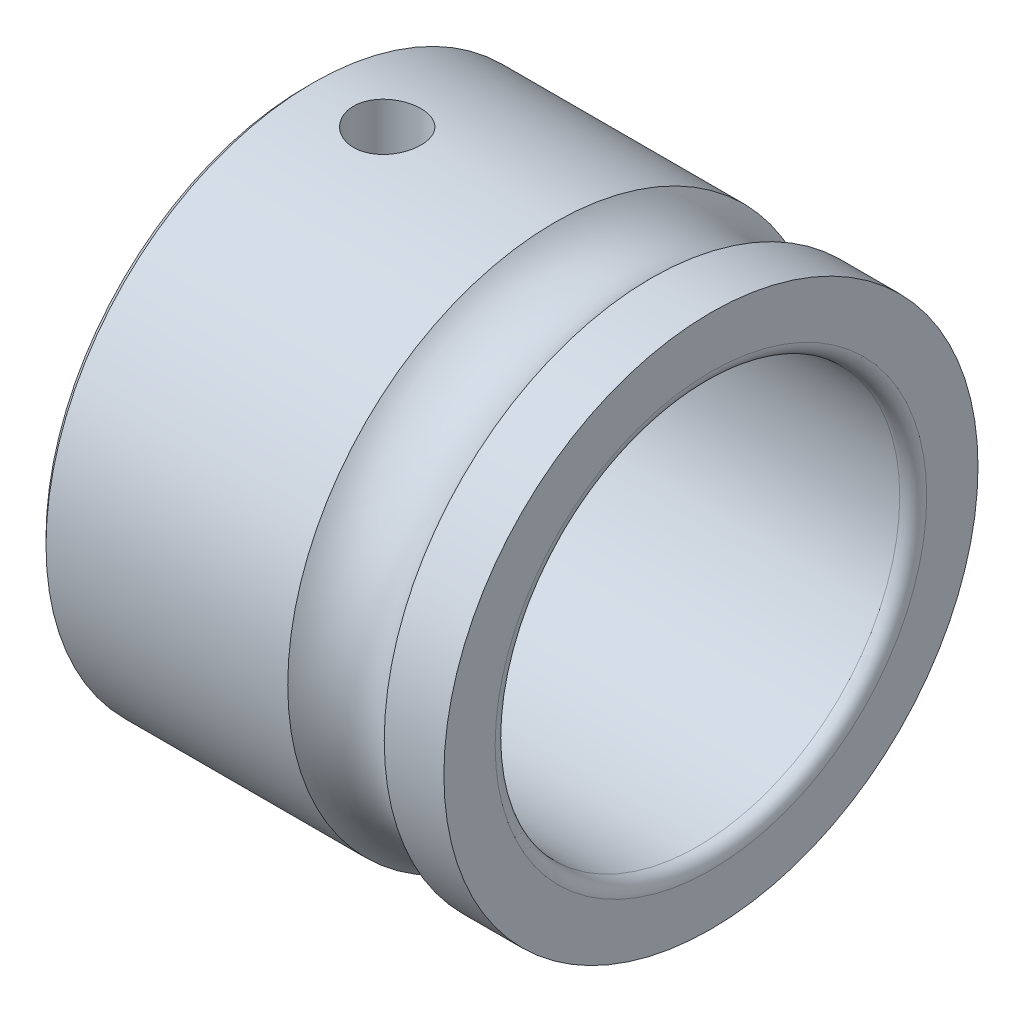
ISO-10303-21;
HEADER;
FILE_DESCRIPTION(('STEP AP214'),'2;1');
FILE_NAME('part.step','',(''),(''),'','','');
FILE_SCHEMA(('AUTOMOTIVE_DESIGN { 1 0 10303 214 1 1 1 1 }'));
ENDSEC;
DATA;
#1=APPLICATION_CONTEXT('core data for automotive mechanical design processes');
#2=APPLICATION_PROTOCOL_DEFINITION('international standard','automotive_design',2000,#1);
#3=PRODUCT_CONTEXT('',#1,'mechanical');
#4=PRODUCT('Part','Part','',(#3));
#5=PRODUCT_RELATED_PRODUCT_CATEGORY('part','',(#4));
#6=PRODUCT_DEFINITION_FORMATION('','',#4);
#7=PRODUCT_DEFINITION_CONTEXT('part definition',#1,'design');
#8=PRODUCT_DEFINITION('design','',#6,#7);
#9=PRODUCT_DEFINITION_SHAPE('','',#8);
#10=(LENGTH_UNIT() NAMED_UNIT(*) SI_UNIT(.MILLI.,.METRE.));
#11=(NAMED_UNIT(*) PLANE_ANGLE_UNIT() SI_UNIT($,.RADIAN.));
#12=(NAMED_UNIT(*) SI_UNIT($,.STERADIAN.) SOLID_ANGLE_UNIT());
#13=UNCERTAINTY_MEASURE_WITH_UNIT(LENGTH_MEASURE(1.E-05),#10,'distance_accuracy_value','');
#14=(GEOMETRIC_REPRESENTATION_CONTEXT(3) GLOBAL_UNCERTAINTY_ASSIGNED_CONTEXT((#13)) GLOBAL_UNIT_ASSIGNED_CONTEXT((#10,
#11,#12)) REPRESENTATION_CONTEXT('',''));
#15=CARTESIAN_POINT('',(0.,0.,0.));
#16=DIRECTION('',(0.,0.,1.));
#17=DIRECTION('',(1.,0.,0.));
#18=AXIS2_PLACEMENT_3D('',#15,#16,#17);
#19=CARTESIAN_POINT('',(0.,0.,0.));
#20=DIRECTION('',(-1.,0.,0.));
#21=DIRECTION('',(0.,0.,1.));
#22=AXIS2_PLACEMENT_3D('',#19,#20,#21);
#23=CYLINDRICAL_SURFACE('',#22,15.);
#24=CARTESIAN_POINT('',(-8.00000000000001,-2.50000000000005,-14.790199457749));
#25=CARTESIAN_POINT('',(-8.13937574816183,-2.49999439841987,-14.790201973666));
#26=CARTESIAN_POINT('',(-8.27882760607148,-2.48830516902833,-14.7921909238523));
#27=CARTESIAN_POINT('',(-8.55381854326318,-2.44187742806642,-14.7999245720004));
#28=CARTESIAN_POINT('',(-8.68935389375808,-2.40711766030865,-14.8056727334637));
#29=CARTESIAN_POINT('',(-8.95249228334162,-2.31562954367054,-14.8202560936731));
#30=CARTESIAN_POINT('',(-9.08010184866226,-2.25891955493203,-14.8290887118401));
#31=CARTESIAN_POINT('',(-9.32398095471778,-2.12518649688951,-14.8488427210228));
#32=CARTESIAN_POINT('',(-9.44025176957734,-2.04816571350137,-14.8597638769423));
#33=CARTESIAN_POINT('',(-9.65931284974457,-1.87518752696659,-14.8825847115588));
#34=CARTESIAN_POINT('',(-9.76197513138622,-1.77906904893238,-14.8944921732794));
#35=CARTESIAN_POINT('',(-9.94979330686182,-1.57097200469532,-14.9178748066858));
#36=CARTESIAN_POINT('',(-10.0349481631154,-1.45899249915002,-14.9293499527173));
#37=CARTESIAN_POINT('',(-10.1858145672193,-1.22152286994841,-14.9506573698271));
#38=CARTESIAN_POINT('',(-10.2514070077318,-1.09595608145676,-14.9604794243234));
#39=CARTESIAN_POINT('',(-10.3605210705306,-0.835395621723921,-14.9772873695709));
#40=CARTESIAN_POINT('',(-10.4040441278849,-0.700402564078241,-14.9842734447266));
#41=CARTESIAN_POINT('',(-10.4673925349839,-0.426143726344296,-14.994567347244));
#42=CARTESIAN_POINT('',(-10.4874329160047,-0.286928886679325,-14.9979085311091));
#43=CARTESIAN_POINT('',(-10.5039157541526,-0.00707528552585247,-15.0006507934278));
#44=CARTESIAN_POINT('',(-10.5003598152472,0.133563378528843,-15.0000521396931));
#45=CARTESIAN_POINT('',(-10.4699186484718,0.410802185078819,-14.9950085843139));
#46=CARTESIAN_POINT('',(-10.4432648365909,0.547428530700084,-14.990601836924));
#47=CARTESIAN_POINT('',(-10.3677489257535,0.814241979611734,-14.9784797877164));
#48=CARTESIAN_POINT('',(-10.3188861504105,0.944428886651446,-14.9707643851321));
#49=CARTESIAN_POINT('',(-10.2001093596847,1.19535614778259,-14.9528269851196));
#50=CARTESIAN_POINT('',(-10.1300999879176,1.31605052301899,-14.9425936732688));
#51=CARTESIAN_POINT('',(-9.97108717736496,1.54406552984658,-14.920757380715));
#52=CARTESIAN_POINT('',(-9.8820822012892,1.65138507791582,-14.9091542891914));
#53=CARTESIAN_POINT('',(-9.68632119338071,1.85097127344661,-14.885702682326));
#54=CARTESIAN_POINT('',(-9.57936290509903,1.94303950225315,-14.8738528973104));
#55=CARTESIAN_POINT('',(-9.35141290978419,2.107954588448,-14.8513795978481));
#56=CARTESIAN_POINT('',(-9.23042107331719,2.18080126853236,-14.8407560947133));
#57=CARTESIAN_POINT('',(-8.97760835812253,2.30524443448823,-14.8219375456182));
#58=CARTESIAN_POINT('',(-8.84577550190792,2.35681702727918,-14.813745233026));
#59=CARTESIAN_POINT('',(-8.57515092769247,2.43702987081556,-14.8007618868988));
#60=CARTESIAN_POINT('',(-8.43635982356759,2.4656721407679,-14.7959705538832));
#61=CARTESIAN_POINT('',(-8.15753384383788,2.49893188487921,-14.7903895942212));
#62=CARTESIAN_POINT('',(-8.01753362029791,2.50383220791238,-14.7895528575867));
#63=CARTESIAN_POINT('',(-7.73871332830919,2.4902227026824,-14.7918503478236));
#64=CARTESIAN_POINT('',(-7.59989321448604,2.47171377862461,-14.7949844213185));
#65=CARTESIAN_POINT('',(-7.32827224080916,2.41205233492804,-14.8048268745502));
#66=CARTESIAN_POINT('',(-7.19543886012201,2.37104379064633,-14.8115125191835));
#67=CARTESIAN_POINT('',(-6.93852983372053,2.26769819019222,-14.827685730055));
#68=CARTESIAN_POINT('',(-6.81445471244911,2.20535985810088,-14.8371734639058));
#69=CARTESIAN_POINT('',(-6.57732540559391,2.06045667322917,-14.8579912839739));
#70=CARTESIAN_POINT('',(-6.46438342724396,1.97771056415931,-14.8693375560035));
#71=CARTESIAN_POINT('',(-6.25388646730502,1.79458946570792,-14.8925466667987));
#72=CARTESIAN_POINT('',(-6.15633256889028,1.69421323638399,-14.9044095418533));
#73=CARTESIAN_POINT('',(-5.97834810727131,1.47742807032875,-14.9274642211826));
#74=CARTESIAN_POINT('',(-5.89810617371548,1.36086325338614,-14.9386477634467));
#75=CARTESIAN_POINT('',(-5.75834467299514,1.11574344794927,-14.9589511243294));
#76=CARTESIAN_POINT('',(-5.69882443552617,0.987188847470571,-14.9680710096998));
#77=CARTESIAN_POINT('',(-5.60248941604516,0.722299051501274,-14.9831835816958));
#78=CARTESIAN_POINT('',(-5.5655759242651,0.586000562602557,-14.9891898456762));
#79=CARTESIAN_POINT('',(-5.51518440103619,0.309030734874157,-14.9974558316928));
#80=CARTESIAN_POINT('',(-5.50170444126766,0.168359756821567,-14.9997158620019));
#81=CARTESIAN_POINT('',(-5.49861811768782,-0.111541275773728,-15.0002303788781));
#82=CARTESIAN_POINT('',(-5.50872474605894,-0.250768160602714,-14.9985330202419));
#83=CARTESIAN_POINT('',(-5.55190392226945,-0.525511974314754,-14.9914217838733));
#84=CARTESIAN_POINT('',(-5.58497634150969,-0.661028923967529,-14.9860079269518));
#85=CARTESIAN_POINT('',(-5.67303816554367,-0.924396445918585,-14.972069888274));
#86=CARTESIAN_POINT('',(-5.72800316821007,-1.05225537215387,-14.9635491704088));
#87=CARTESIAN_POINT('',(-5.8582579362306,-1.29698045298221,-14.9443275687803));
#88=CARTESIAN_POINT('',(-5.93354866506247,-1.41384608611827,-14.9336265816742));
#89=CARTESIAN_POINT('',(-6.10333509246052,-1.63471294552644,-14.9110762961641));
#90=CARTESIAN_POINT('',(-6.19804095475128,-1.73855143060279,-14.8992152454112));
#91=CARTESIAN_POINT('',(-6.40352830790383,-1.92896387595095,-14.8757630331437));
#92=CARTESIAN_POINT('',(-6.51431355891255,-2.01553378671194,-14.8641719354951));
#93=CARTESIAN_POINT('',(-6.74974532248963,-2.16951427091091,-14.8424834353391));
#94=CARTESIAN_POINT('',(-6.8744843397655,-2.23678498905774,-14.8323971784578));
#95=CARTESIAN_POINT('',(-7.13360923583816,-2.34931453640431,-14.8149921009131));
#96=CARTESIAN_POINT('',(-7.26798532267737,-2.39459535522311,-14.8076705172488));
#97=CARTESIAN_POINT('',(-7.50240376948739,-2.45202605312746,-14.7982474485649));
#98=CARTESIAN_POINT('',(-7.60102680796262,-2.46998741767143,-14.7952462341946));
#99=CARTESIAN_POINT('',(-7.79975348483695,-2.49397629518136,-14.7912213528807));
#100=CARTESIAN_POINT('',(-7.89985709632421,-2.50000402479282,-14.7901976500369));
#101=CARTESIAN_POINT('',(-8.00000000000001,-2.50000000000005,-14.790199457749));
#102=B_SPLINE_CURVE_WITH_KNOTS('',3,(#24,#25,#26,#27,#28,#29,#30,#31,#32,#33,#34,#35,#36,#37,
#38,#39,#40,#41,#42,#43,#44,#45,#46,#47,#48,#49,#50,#51,#52,#53,#54,#55,#56,#57,#58,#59,#60,#61,
#62,#63,#64,#65,#66,#67,#68,#69,#70,#71,#72,#73,#74,#75,#76,#77,#78,#79,#80,#81,#82,#83,#84,#85,
#86,#87,#88,#89,#90,#91,#92,#93,#94,#95,#96,#97,#98,#99,#100,#101),.UNSPECIFIED.,.T.,.F.,(4,2,2,
2,2,2,2,2,2,2,2,2,2,2,2,2,2,2,2,2,2,2,2,2,2,2,2,2,2,2,2,2,2,2,2,2,2,2,4),(0.,0.417761038927738,
0.835907519962966,1.25370499787518,1.67145547405273,2.09289159155714,2.51435267834446,
2.93832980111434,3.36227935111112,3.78231567472564,4.2023234465269,4.61817121164667,
5.03403164249531,5.45179604139424,5.86959426226762,6.29246123462121,6.71533210746017,
7.13867662498601,7.56198385938075,7.98023542420408,8.39847083413974,8.81406064635489,
9.22967532293572,9.64912342762699,10.0686010443069,10.4924411303538,10.916267504767,
11.3382298441764,11.7601574591235,12.1769777626591,12.5937957321882,13.0101503983245,
13.4265248039233,13.8476699746325,14.2689137888181,14.6931372761832,15.1169356674445,
15.4171067054376,15.7172722940181),.UNSPECIFIED.);
#103=CARTESIAN_POINT('',(-8.00000000000001,-2.50000000000005,-14.790199457749));
#104=VERTEX_POINT('',#103);
#105=EDGE_CURVE('E86',#104,#104,#102,.T.);
#106=ORIENTED_EDGE('',*,*,#105,.T.);
#107=EDGE_LOOP('',(#106));
#108=FACE_BOUND('',#107,.T.);
#109=CARTESIAN_POINT('',(-8.00000000000001,14.7901994577491,-2.49999999999999));
#110=CARTESIAN_POINT('',(-8.13937574816183,14.7902019736661,-2.49999439841982));
#111=CARTESIAN_POINT('',(-8.27882760607149,14.7921909238524,-2.48830516902827));
#112=CARTESIAN_POINT('',(-8.55381854326318,14.7999245720004,-2.44187742806637));
#113=CARTESIAN_POINT('',(-8.68935389375808,14.8056727334637,-2.4071176603086));
#114=CARTESIAN_POINT('',(-8.95249228334162,14.8202560936731,-2.31562954367049));
#115=CARTESIAN_POINT('',(-9.08010184866226,14.8290887118401,-2.25891955493198));
#116=CARTESIAN_POINT('',(-9.32398095471778,14.8488427210228,-2.12518649688946));
#117=CARTESIAN_POINT('',(-9.44025176957734,14.8597638769423,-2.04816571350132));
#118=CARTESIAN_POINT('',(-9.65931284974457,14.8825847115588,-1.87518752696654));
#119=CARTESIAN_POINT('',(-9.76197513138623,14.8944921732795,-1.77906904893233));
#120=CARTESIAN_POINT('',(-9.94979330686182,14.9178748066858,-1.57097200469527));
#121=CARTESIAN_POINT('',(-10.0349481631154,14.9293499527174,-1.45899249914997));
#122=CARTESIAN_POINT('',(-10.1858145672193,14.9506573698271,-1.22152286994835));
#123=CARTESIAN_POINT('',(-10.2514070077318,14.9604794243234,-1.0959560814567));
#124=CARTESIAN_POINT('',(-10.3605210705306,14.9772873695709,-0.835395621723863));
#125=CARTESIAN_POINT('',(-10.4040441278849,14.9842734447266,-0.700402564078185));
#126=CARTESIAN_POINT('',(-10.4673925349839,14.994567347244,-0.426143726344241));
#127=CARTESIAN_POINT('',(-10.4874329160047,14.9979085311091,-0.28692888667927));
#128=CARTESIAN_POINT('',(-10.5039157541526,15.0006507934278,-0.00707528552579769));
#129=CARTESIAN_POINT('',(-10.5003598152472,15.0000521396931,0.133563378528897));
#130=CARTESIAN_POINT('',(-10.4699186484718,14.9950085843139,0.410802185078873));
#131=CARTESIAN_POINT('',(-10.4432648365909,14.990601836924,0.547428530700137));
#132=CARTESIAN_POINT('',(-10.3677489257535,14.9784797877164,0.814241979611787));
#133=CARTESIAN_POINT('',(-10.3188861504105,14.9707643851321,0.944428886651499));
#134=CARTESIAN_POINT('',(-10.2001093596847,14.9528269851196,1.19535614778264));
#135=CARTESIAN_POINT('',(-10.1300999879176,14.9425936732688,1.31605052301904));
#136=CARTESIAN_POINT('',(-9.97108717736497,14.920757380715,1.54406552984663));
#137=CARTESIAN_POINT('',(-9.8820822012892,14.9091542891914,1.65138507791587));
#138=CARTESIAN_POINT('',(-9.68632119338071,14.885702682326,1.85097127344666));
#139=CARTESIAN_POINT('',(-9.57936290509904,14.8738528973104,1.9430395022532));
#140=CARTESIAN_POINT('',(-9.3514129097842,14.8513795978481,2.10795458844806));
#141=CARTESIAN_POINT('',(-9.2304210733172,14.8407560947133,2.18080126853241));
#142=CARTESIAN_POINT('',(-8.97760835812254,14.8219375456182,2.30524443448828));
#143=CARTESIAN_POINT('',(-8.84577550190793,14.813745233026,2.35681702727924));
#144=CARTESIAN_POINT('',(-8.57515092769247,14.8007618868988,2.43702987081561));
#145=CARTESIAN_POINT('',(-8.43635982356759,14.7959705538832,2.46567214076794));
#146=CARTESIAN_POINT('',(-8.15753384383788,14.7903895942212,2.49893188487925));
#147=CARTESIAN_POINT('',(-8.01753362029791,14.7895528575867,2.50383220791243));
#148=CARTESIAN_POINT('',(-7.7387133283092,14.7918503478236,2.49022270268245));
#149=CARTESIAN_POINT('',(-7.59989321448604,14.7949844213185,2.47171377862466));
#150=CARTESIAN_POINT('',(-7.32827224080916,14.8048268745502,2.41205233492809));
#151=CARTESIAN_POINT('',(-7.19543886012201,14.8115125191835,2.37104379064638));
#152=CARTESIAN_POINT('',(-6.93852983372053,14.827685730055,2.26769819019227));
#153=CARTESIAN_POINT('',(-6.81445471244912,14.8371734639058,2.20535985810093));
#154=CARTESIAN_POINT('',(-6.57732540559391,14.8579912839739,2.06045667322922));
#155=CARTESIAN_POINT('',(-6.46438342724396,14.8693375560035,1.97771056415936));
#156=CARTESIAN_POINT('',(-6.25388646730502,14.8925466667987,1.79458946570798));
#157=CARTESIAN_POINT('',(-6.15633256889028,14.9044095418533,1.69421323638404));
#158=CARTESIAN_POINT('',(-5.97834810727132,14.9274642211826,1.47742807032881));
#159=CARTESIAN_POINT('',(-5.89810617371548,14.9386477634467,1.36086325338619));
#160=CARTESIAN_POINT('',(-5.75834467299514,14.9589511243294,1.11574344794932));
#161=CARTESIAN_POINT('',(-5.69882443552617,14.9680710096998,0.987188847470625));
#162=CARTESIAN_POINT('',(-5.60248941604515,14.9831835816958,0.722299051501328));
#163=CARTESIAN_POINT('',(-5.5655759242651,14.9891898456762,0.58600056260261));
#164=CARTESIAN_POINT('',(-5.5151844010362,14.9974558316928,0.309030734874209));
#165=CARTESIAN_POINT('',(-5.50170444126767,14.9997158620019,0.168359756821619));
#166=CARTESIAN_POINT('',(-5.49861811768782,15.0002303788781,-0.111541275773676));
#167=CARTESIAN_POINT('',(-5.50872474605894,14.9985330202419,-0.250768160602663));
#168=CARTESIAN_POINT('',(-5.55190392226945,14.9914217838733,-0.525511974314701));
#169=CARTESIAN_POINT('',(-5.58497634150969,14.9860079269518,-0.661028923967476));
#170=CARTESIAN_POINT('',(-5.67303816554367,14.972069888274,-0.924396445918531));
#171=CARTESIAN_POINT('',(-5.72800316821007,14.9635491704088,-1.05225537215381));
#172=CARTESIAN_POINT('',(-5.8582579362306,14.9443275687803,-1.29698045298216));
#173=CARTESIAN_POINT('',(-5.93354866506247,14.9336265816742,-1.41384608611821));
#174=CARTESIAN_POINT('',(-6.10333509246052,14.9110762961641,-1.63471294552639));
#175=CARTESIAN_POINT('',(-6.19804095475128,14.8992152454112,-1.73855143060274));
#176=CARTESIAN_POINT('',(-6.40352830790383,14.8757630331437,-1.9289638759509));
#177=CARTESIAN_POINT('',(-6.51431355891255,14.8641719354951,-2.01553378671189));
#178=CARTESIAN_POINT('',(-6.74974532248963,14.8424834353391,-2.16951427091086));
#179=CARTESIAN_POINT('',(-6.8744843397655,14.8323971784578,-2.23678498905769));
#180=CARTESIAN_POINT('',(-7.13360923583816,14.8149921009131,-2.34931453640426));
#181=CARTESIAN_POINT('',(-7.26798532267738,14.8076705172488,-2.39459535522306));
#182=CARTESIAN_POINT('',(-7.5024037694874,14.7982474485649,-2.45202605312741));
#183=CARTESIAN_POINT('',(-7.60102680796262,14.7952462341947,-2.46998741767138));
#184=CARTESIAN_POINT('',(-7.79975348483695,14.7912213528807,-2.4939762951813));
#185=CARTESIAN_POINT('',(-7.89985709632421,14.7901976500369,-2.50000402479277));
#186=CARTESIAN_POINT('',(-8.00000000000001,14.7901994577491,-2.49999999999999));
#187=B_SPLINE_CURVE_WITH_KNOTS('',3,(#109,#110,#111,#112,#113,#114,#115,#116,#117,#118,#119,
#120,#121,#122,#123,#124,#125,#126,#127,#128,#129,#130,#131,#132,#133,#134,#135,#136,#137,#138,
#139,#140,#141,#142,#143,#144,#145,#146,#147,#148,#149,#150,#151,#152,#153,#154,#155,#156,#157,
#158,#159,#160,#161,#162,#163,#164,#165,#166,#167,#168,#169,#170,#171,#172,#173,#174,#175,#176,
#177,#178,#179,#180,#181,#182,#183,#184,#185,#186),.UNSPECIFIED.,.T.,.F.,(4,2,2,2,2,2,2,2,2,2,2,
2,2,2,2,2,2,2,2,2,2,2,2,2,2,2,2,2,2,2,2,2,2,2,2,2,2,2,4),(0.,0.41776103892774,0.835907519962967,
1.25370499787518,1.67145547405273,2.09289159155714,2.51435267834447,2.93832980111434,
3.36227935111112,3.78231567472564,4.20232344652691,4.61817121164667,5.03403164249531,
5.45179604139424,5.86959426226762,6.29246123462121,6.71533210746017,7.13867662498601,
7.56198385938075,7.98023542420409,8.39847083413974,8.81406064635489,9.22967532293572,
9.64912342762699,10.0686010443069,10.4924411303538,10.916267504767,11.3382298441764,
11.7601574591235,12.1769777626591,12.5937957321882,13.0101503983245,13.4265248039233,
13.8476699746325,14.2689137888181,14.6931372761832,15.1169356674445,15.4171067054376,
15.7172722940181),.UNSPECIFIED.);
#188=CARTESIAN_POINT('',(-8.00000000000001,14.7901994577491,-2.49999999999999));
#189=VERTEX_POINT('',#188);
#190=EDGE_CURVE('E80',#189,#189,#187,.T.);
#191=ORIENTED_EDGE('',*,*,#190,.T.);
#192=EDGE_LOOP('',(#191));
#193=FACE_BOUND('',#192,.T.);
#194=CARTESIAN_POINT('',(-13.,0.,0.));
#195=DIRECTION('',(-1.,0.,0.));
#196=DIRECTION('',(0.,0.,1.));
#197=AXIS2_PLACEMENT_3D('',#194,#195,#196);
#198=CIRCLE('',#197,15.);
#199=CARTESIAN_POINT('',(-13.,0.,15.));
#200=VERTEX_POINT('',#199);
#201=EDGE_CURVE('E62',#200,#200,#198,.T.);
#202=ORIENTED_EDGE('',*,*,#201,.T.);
#203=EDGE_LOOP('',(#202));
#204=FACE_BOUND('',#203,.T.);
#205=CARTESIAN_POINT('',(15.,0.,0.));
#206=DIRECTION('',(-1.,0.,0.));
#207=DIRECTION('',(0.,0.,1.));
#208=AXIS2_PLACEMENT_3D('',#205,#206,#207);
#209=CIRCLE('',#208,15.);
#210=CARTESIAN_POINT('',(15.,0.,15.));
#211=VERTEX_POINT('',#210);
#212=EDGE_CURVE('E65',#211,#211,#209,.T.);
#213=ORIENTED_EDGE('',*,*,#212,.F.);
#214=EDGE_LOOP('',(#213));
#215=FACE_BOUND('',#214,.T.);
#216=ADVANCED_FACE('F36',(#108,#193,#204,#215),#23,.F.);
#217=CARTESIAN_POINT('',(15.,0.,0.));
#218=DIRECTION('',(-1.,0.,0.));
#219=DIRECTION('',(0.,0.,1.));
#220=AXIS2_PLACEMENT_3D('',#217,#218,#219);
#221=TOROIDAL_SURFACE('',#220,16.,0.999999999999999);
#222=CARTESIAN_POINT('',(16.,0.,0.));
#223=DIRECTION('',(-1.,0.,0.));
#224=DIRECTION('',(0.,0.,1.));
#225=AXIS2_PLACEMENT_3D('',#222,#223,#224);
#226=CIRCLE('',#225,16.);
#227=CARTESIAN_POINT('',(16.,0.,16.));
#228=VERTEX_POINT('',#227);
#229=EDGE_CURVE('E68',#228,#228,#226,.T.);
#230=ORIENTED_EDGE('',*,*,#229,.F.);
#231=EDGE_LOOP('',(#230));
#232=FACE_BOUND('',#231,.T.);
#233=ORIENTED_EDGE('',*,*,#212,.T.);
#234=EDGE_LOOP('',(#233));
#235=FACE_BOUND('',#234,.T.);
#236=ADVANCED_FACE('F128',(#232,#235),#221,.T.);
#237=CARTESIAN_POINT('',(16.,0.,-19.8));
#238=DIRECTION('',(-1.,0.,0.));
#239=DIRECTION('',(0.,0.,1.));
#240=AXIS2_PLACEMENT_3D('',#237,#238,#239);
#241=PLANE('',#240);
#242=CARTESIAN_POINT('',(16.,0.,0.));
#243=DIRECTION('',(-1.,0.,0.));
#244=DIRECTION('',(0.,0.,1.));
#245=AXIS2_PLACEMENT_3D('',#242,#243,#244);
#246=CIRCLE('',#245,19.8);
#247=CARTESIAN_POINT('',(16.,0.,19.8));
#248=VERTEX_POINT('',#247);
#249=EDGE_CURVE('E71',#248,#248,#246,.T.);
#250=ORIENTED_EDGE('',*,*,#249,.F.);
#251=EDGE_LOOP('',(#250));
#252=FACE_BOUND('',#251,.T.);
#253=ORIENTED_EDGE('',*,*,#229,.T.);
#254=EDGE_LOOP('',(#253));
#255=FACE_BOUND('',#254,.T.);
#256=ADVANCED_FACE('F125',(#252,#255),#241,.F.);
#257=CARTESIAN_POINT('',(0.,0.,0.));
#258=DIRECTION('',(-1.,0.,0.));
#259=DIRECTION('',(0.,0.,1.));
#260=AXIS2_PLACEMENT_3D('',#257,#258,#259);
#261=CYLINDRICAL_SURFACE('',#260,19.8);
#262=CARTESIAN_POINT('',(11.5777087639997,0.,0.));
#263=DIRECTION('',(-1.,0.,0.));
#264=DIRECTION('',(0.,0.,1.));
#265=AXIS2_PLACEMENT_3D('',#262,#263,#264);
#266=CIRCLE('',#265,19.8);
#267=CARTESIAN_POINT('',(11.5777087639997,0.,19.8));
#268=VERTEX_POINT('',#267);
#269=EDGE_CURVE('E74',#268,#268,#266,.T.);
#270=ORIENTED_EDGE('',*,*,#269,.F.);
#271=EDGE_LOOP('',(#270));
#272=FACE_BOUND('',#271,.T.);
#273=ORIENTED_EDGE('',*,*,#249,.T.);
#274=EDGE_LOOP('',(#273));
#275=FACE_BOUND('',#274,.T.);
#276=ADVANCED_FACE('F121',(#272,#275),#261,.T.);
#277=CARTESIAN_POINT('',(8.00000000000001,0.,0.));
#278=DIRECTION('',(-1.,0.,0.));
#279=DIRECTION('',(0.,0.,1.));
#280=AXIS2_PLACEMENT_3D('',#277,#278,#279);
#281=TOROIDAL_SURFACE('',#280,23.,4.8);
#282=CARTESIAN_POINT('',(4.42229123600034,0.,0.));
#283=DIRECTION('',(-1.,0.,0.));
#284=DIRECTION('',(0.,0.,1.));
#285=AXIS2_PLACEMENT_3D('',#282,#283,#284);
#286=CIRCLE('',#285,19.8);
#287=CARTESIAN_POINT('',(4.42229123600034,0.,19.8));
#288=VERTEX_POINT('',#287);
#289=EDGE_CURVE('E77',#288,#288,#286,.T.);
#290=ORIENTED_EDGE('',*,*,#289,.F.);
#291=EDGE_LOOP('',(#290));
#292=FACE_BOUND('',#291,.T.);
#293=ORIENTED_EDGE('',*,*,#269,.T.);
#294=EDGE_LOOP('',(#293));
#295=FACE_BOUND('',#294,.T.);
#296=ADVANCED_FACE('F117',(#292,#295),#281,.F.);
#297=CARTESIAN_POINT('',(0.,0.,0.));
#298=DIRECTION('',(-1.,0.,0.));
#299=DIRECTION('',(0.,0.,1.));
#300=AXIS2_PLACEMENT_3D('',#297,#298,#299);
#301=CYLINDRICAL_SURFACE('',#300,19.8);
#302=CARTESIAN_POINT('',(-10.5,0.,-19.8));
#303=CARTESIAN_POINT('',(-10.4999940667672,-0.139829290332162,-19.7999980330896));
#304=CARTESIAN_POINT('',(-10.4882291056694,-0.279745669516795,-19.7985031325273));
#305=CARTESIAN_POINT('',(-10.4414825442625,-0.555684226316978,-19.7926834750852));
#306=CARTESIAN_POINT('',(-10.4064767777726,-0.69170219656544,-19.7883557726765));
#307=CARTESIAN_POINT('',(-10.3142970956759,-0.955809276495431,-19.7773579950367));
#308=CARTESIAN_POINT('',(-10.2571381868905,-1.08390368572719,-19.7706895057723));
#309=CARTESIAN_POINT('',(-10.1223077525811,-1.32865787045246,-19.7557516030697));
#310=CARTESIAN_POINT('',(-10.0446397145875,-1.44531958542929,-19.7474824618825));
#311=CARTESIAN_POINT('',(-9.87052979226367,-1.66457562340393,-19.7302144351574));
#312=CARTESIAN_POINT('',(-9.77399579380114,-1.76709653492728,-19.7212121009181));
#313=CARTESIAN_POINT('',(-9.5650919887003,-1.95452848391428,-19.7035200762319));
#314=CARTESIAN_POINT('',(-9.45272137086594,-2.03943861875354,-19.6948304018289));
#315=CARTESIAN_POINT('',(-9.21485630039015,-2.18951273944303,-19.6787136426831));
#316=CARTESIAN_POINT('',(-9.08931806045101,-2.25460784139269,-19.6712910009798));
#317=CARTESIAN_POINT('',(-8.82898218111281,-2.36276415828076,-19.658594275247));
#318=CARTESIAN_POINT('',(-8.69418490005865,-2.40582622540087,-19.6533201081217));
#319=CARTESIAN_POINT('',(-8.41991973253341,-2.46847079414425,-19.6455504670315));
#320=CARTESIAN_POINT('',(-8.28048060028157,-2.48817733326353,-19.6430403188939));
#321=CARTESIAN_POINT('',(-8.00025346901603,-2.50393528390183,-19.6410380292202));
#322=CARTESIAN_POINT('',(-7.8594655255467,-2.49998766535999,-19.6415457639357));
#323=CARTESIAN_POINT('',(-7.58140221010846,-2.46865115839432,-19.6455084439626));
#324=CARTESIAN_POINT('',(-7.44411115256481,-2.44139897275518,-19.6489462015971));
#325=CARTESIAN_POINT('',(-7.17606660121647,-2.36444024312506,-19.6583547673219));
#326=CARTESIAN_POINT('',(-7.04531324238764,-2.31473323574937,-19.664325627686));
#327=CARTESIAN_POINT('',(-6.79363142276517,-2.19412914828821,-19.6781470948829));
#328=CARTESIAN_POINT('',(-6.67273169524505,-2.12317273271272,-19.6860029528911));
#329=CARTESIAN_POINT('',(-6.4445039181482,-1.96212645969561,-19.7027052072141));
#330=CARTESIAN_POINT('',(-6.33717650224835,-1.87203570941793,-19.711551649742));
#331=CARTESIAN_POINT('',(-6.13834656842984,-1.67452083593359,-19.729314679851));
#332=CARTESIAN_POINT('',(-6.04696105227669,-1.56697889588231,-19.7382313219438));
#333=CARTESIAN_POINT('',(-5.88352025510012,-1.33801983224012,-19.7550716849928));
#334=CARTESIAN_POINT('',(-5.81146502020562,-1.21660267553901,-19.7629954035796));
#335=CARTESIAN_POINT('',(-5.68872980692073,-0.963249018422195,-19.776962190998));
#336=CARTESIAN_POINT('',(-5.63805723332779,-0.831308892687177,-19.783004608147));
#337=CARTESIAN_POINT('',(-5.55961904338424,-0.560699317401681,-19.7925220863546));
#338=CARTESIAN_POINT('',(-5.5318523327118,-0.422030189662754,-19.7959972700614));
#339=CARTESIAN_POINT('',(-5.50016588943688,-0.142910486710996,-19.7999727645862));
#340=CARTESIAN_POINT('',(-5.49608499590551,-0.00247848202120934,-19.80049317945));
#341=CARTESIAN_POINT('',(-5.51146060828097,0.277067458042134,-19.7985548001959));
#342=CARTESIAN_POINT('',(-5.53091660252092,0.416181422002236,-19.7960960708415));
#343=CARTESIAN_POINT('',(-5.59267981667831,0.688666226973903,-19.788488198791));
#344=CARTESIAN_POINT('',(-5.63491011549973,0.822054777876038,-19.7833481143755));
#345=CARTESIAN_POINT('',(-5.74094314985626,1.07985662295255,-19.7709529542626));
#346=CARTESIAN_POINT('',(-5.80474663139222,1.20426960657119,-19.7636978054275));
#347=CARTESIAN_POINT('',(-5.95250425388682,1.44130792712169,-19.7478311463523));
#348=CARTESIAN_POINT('',(-6.03656255015398,1.55386786714142,-19.7392127071065));
#349=CARTESIAN_POINT('',(-6.22229645248975,1.76333939771557,-19.721605023567));
#350=CARTESIAN_POINT('',(-6.3239727726007,1.86025035372337,-19.7126157642554));
#351=CARTESIAN_POINT('',(-6.54276676332826,2.03624544500879,-19.6952174800736));
#352=CARTESIAN_POINT('',(-6.65997074720559,2.11522269363902,-19.6868121313064));
#353=CARTESIAN_POINT('',(-6.9060746077576,2.25236986816829,-19.6715940258927));
#354=CARTESIAN_POINT('',(-7.03497424590155,2.31054021830069,-19.6647812367764));
#355=CARTESIAN_POINT('',(-7.30046676053129,2.40424965009846,-19.6535447249027));
#356=CARTESIAN_POINT('',(-7.43703815229509,2.43984880876823,-19.6491146649271));
#357=CARTESIAN_POINT('',(-7.71427987619553,2.48759869591714,-19.6431270772937));
#358=CARTESIAN_POINT('',(-7.85495001313556,2.49975053919282,-19.6415694130686));
#359=CARTESIAN_POINT('',(-8.13533264790674,2.50024011551018,-19.641507012754));
#360=CARTESIAN_POINT('',(-8.27504487742561,2.4887457772273,-19.6429807484869));
#361=CARTESIAN_POINT('',(-8.55053461931284,2.44262507625425,-19.6487687867356));
#362=CARTESIAN_POINT('',(-8.68631213152667,2.40799871265557,-19.653083089363));
#363=CARTESIAN_POINT('',(-8.95005497568818,2.31664970729283,-19.6640594482104));
#364=CARTESIAN_POINT('',(-9.0780232073381,2.25993532559761,-19.6707206267005));
#365=CARTESIAN_POINT('',(-9.32265361776396,2.12603671962328,-19.6856416194043));
#366=CARTESIAN_POINT('',(-9.43931564348751,2.04885221829249,-19.6939014552546));
#367=CARTESIAN_POINT('',(-9.65888022708115,1.87558191331236,-19.7111593467193));
#368=CARTESIAN_POINT('',(-9.76168368461517,1.77937098523126,-19.7201620460634));
#369=CARTESIAN_POINT('',(-9.94975072271648,1.57104012984588,-19.7378503892999));
#370=CARTESIAN_POINT('',(-10.0350101652327,1.45891645976717,-19.7465359579953));
#371=CARTESIAN_POINT('',(-10.1858512544269,1.22144344570152,-19.7626486818248));
#372=CARTESIAN_POINT('',(-10.2513553046956,1.09604449651216,-19.7700708259681));
#373=CARTESIAN_POINT('',(-10.3602817061437,0.836002125393288,-19.7827697295002));
#374=CARTESIAN_POINT('',(-10.40372799924,0.701368907534139,-19.7880488137545));
#375=CARTESIAN_POINT('',(-10.4569310544186,0.471702804295499,-19.7945973344448));
#376=CARTESIAN_POINT('',(-10.4730586293467,0.378116850352496,-19.7966134390324));
#377=CARTESIAN_POINT('',(-10.4945950742822,0.189700621045759,-19.799315434016));
#378=CARTESIAN_POINT('',(-10.5000040255365,0.0948703551193434,-19.800001334495));
#379=CARTESIAN_POINT('',(-10.5,0.,-19.8));
#380=B_SPLINE_CURVE_WITH_KNOTS('',3,(#302,#303,#304,#305,#306,#307,#308,#309,#310,#311,#312,
#313,#314,#315,#316,#317,#318,#319,#320,#321,#322,#323,#324,#325,#326,#327,#328,#329,#330,#331,
#332,#333,#334,#335,#336,#337,#338,#339,#340,#341,#342,#343,#344,#345,#346,#347,#348,#349,#350,
#351,#352,#353,#354,#355,#356,#357,#358,#359,#360,#361,#362,#363,#364,#365,#366,#367,#368,#369,
#370,#371,#372,#373,#374,#375,#376,#377,#378,#379),.UNSPECIFIED.,.T.,.F.,(4,2,2,2,2,2,2,2,2,2,2,
2,2,2,2,2,2,2,2,2,2,2,2,2,2,2,2,2,2,2,2,2,2,2,2,2,2,2,4),(0.,0.419141333302635,
0.838719180848743,1.258013296395,1.67723615779998,2.09855948037112,2.51990439215359,
2.94269774299277,3.36547474002503,3.78599622809001,4.20650047278236,4.62455486054726,
5.04261787580742,5.46185932443069,5.8811203397732,6.30333960669488,6.72555988117267,
7.14792625041857,7.57027244004866,7.98974153936437,8.40920152003213,8.82725355107821,
9.24532003984572,9.66558401587591,10.0858650288053,10.5085887942955,10.931303940349,
11.3528891830814,11.7744543811584,12.1930360762155,12.6116177877123,13.0300431158277,
13.4484741073861,13.8697542876725,14.2911337203644,14.7141473393607,15.1367008242669,
15.4210789288454,15.7054548778415),.UNSPECIFIED.);
#381=CARTESIAN_POINT('',(-10.5,0.,-19.8));
#382=VERTEX_POINT('',#381);
#383=EDGE_CURVE('E152',#382,#382,#380,.T.);
#384=ORIENTED_EDGE('',*,*,#383,.T.);
#385=EDGE_LOOP('',(#384));
#386=FACE_BOUND('',#385,.T.);
#387=CARTESIAN_POINT('',(-10.5,19.8,0.));
#388=CARTESIAN_POINT('',(-10.4999940667672,19.7999980330897,-0.139829290332091));
#389=CARTESIAN_POINT('',(-10.4882291056694,19.7985031325273,-0.279745669516724));
#390=CARTESIAN_POINT('',(-10.4414825442625,19.7926834750852,-0.555684226316906));
#391=CARTESIAN_POINT('',(-10.4064767777726,19.7883557726765,-0.691702196565367));
#392=CARTESIAN_POINT('',(-10.3142970956759,19.7773579950367,-0.955809276495359));
#393=CARTESIAN_POINT('',(-10.2571381868905,19.7706895057723,-1.08390368572711));
#394=CARTESIAN_POINT('',(-10.1223077525811,19.7557516030697,-1.32865787045239));
#395=CARTESIAN_POINT('',(-10.0446397145875,19.7474824618825,-1.44531958542922));
#396=CARTESIAN_POINT('',(-9.87052979226368,19.7302144351574,-1.66457562340387));
#397=CARTESIAN_POINT('',(-9.77399579380115,19.7212121009181,-1.76709653492721));
#398=CARTESIAN_POINT('',(-9.5650919887003,19.7035200762319,-1.95452848391421));
#399=CARTESIAN_POINT('',(-9.45272137086594,19.694830401829,-2.03943861875347));
#400=CARTESIAN_POINT('',(-9.21485630039015,19.6787136426831,-2.18951273944296));
#401=CARTESIAN_POINT('',(-9.08931806045101,19.6712910009798,-2.25460784139262));
#402=CARTESIAN_POINT('',(-8.82898218111281,19.658594275247,-2.36276415828069));
#403=CARTESIAN_POINT('',(-8.69418490005865,19.6533201081217,-2.4058262254008));
#404=CARTESIAN_POINT('',(-8.41991973253342,19.6455504670316,-2.46847079414418));
#405=CARTESIAN_POINT('',(-8.28048060028158,19.6430403188939,-2.48817733326346));
#406=CARTESIAN_POINT('',(-8.00025346901603,19.6410380292202,-2.50393528390176));
#407=CARTESIAN_POINT('',(-7.8594655255467,19.6415457639357,-2.49998766535992));
#408=CARTESIAN_POINT('',(-7.58140221010847,19.6455084439627,-2.46865115839425));
#409=CARTESIAN_POINT('',(-7.44411115256481,19.6489462015971,-2.4413989727551));
#410=CARTESIAN_POINT('',(-7.17606660121647,19.6583547673219,-2.36444024312499));
#411=CARTESIAN_POINT('',(-7.04531324238764,19.664325627686,-2.31473323574929));
#412=CARTESIAN_POINT('',(-6.79363142276517,19.6781470948829,-2.19412914828814));
#413=CARTESIAN_POINT('',(-6.67273169524505,19.6860029528911,-2.12317273271265));
#414=CARTESIAN_POINT('',(-6.4445039181482,19.7027052072141,-1.96212645969554));
#415=CARTESIAN_POINT('',(-6.33717650224835,19.711551649742,-1.87203570941786));
#416=CARTESIAN_POINT('',(-6.13834656842984,19.7293146798511,-1.67452083593352));
#417=CARTESIAN_POINT('',(-6.04696105227669,19.7382313219438,-1.56697889588224));
#418=CARTESIAN_POINT('',(-5.88352025510013,19.7550716849928,-1.33801983224005));
#419=CARTESIAN_POINT('',(-5.81146502020563,19.7629954035796,-1.21660267553894));
#420=CARTESIAN_POINT('',(-5.68872980692073,19.776962190998,-0.963249018422125));
#421=CARTESIAN_POINT('',(-5.63805723332779,19.783004608147,-0.831308892687106));
#422=CARTESIAN_POINT('',(-5.55961904338424,19.7925220863546,-0.560699317401607));
#423=CARTESIAN_POINT('',(-5.5318523327118,19.7959972700614,-0.422030189662678));
#424=CARTESIAN_POINT('',(-5.50016588943688,19.7999727645862,-0.142910486710921));
#425=CARTESIAN_POINT('',(-5.49608499590551,19.80049317945,-0.00247848202113556));
#426=CARTESIAN_POINT('',(-5.51146060828098,19.7985548001959,0.277067458042204));
#427=CARTESIAN_POINT('',(-5.53091660252093,19.7960960708415,0.416181422002304));
#428=CARTESIAN_POINT('',(-5.59267981667832,19.7884881987911,0.68866622697397));
#429=CARTESIAN_POINT('',(-5.63491011549973,19.7833481143755,0.822054777876105));
#430=CARTESIAN_POINT('',(-5.74094314985626,19.7709529542626,1.07985662295262));
#431=CARTESIAN_POINT('',(-5.80474663139223,19.7636978054275,1.20426960657126));
#432=CARTESIAN_POINT('',(-5.95250425388683,19.7478311463523,1.44130792712176));
#433=CARTESIAN_POINT('',(-6.03656255015398,19.7392127071065,1.55386786714148));
#434=CARTESIAN_POINT('',(-6.22229645248975,19.7216050235669,1.76333939771564));
#435=CARTESIAN_POINT('',(-6.3239727726007,19.7126157642554,1.86025035372344));
#436=CARTESIAN_POINT('',(-6.54276676332826,19.6952174800736,2.03624544500886));
#437=CARTESIAN_POINT('',(-6.65997074720559,19.6868121313064,2.11522269363909));
#438=CARTESIAN_POINT('',(-6.9060746077576,19.6715940258927,2.25236986816836));
#439=CARTESIAN_POINT('',(-7.03497424590155,19.6647812367764,2.31054021830076));
#440=CARTESIAN_POINT('',(-7.30046676053129,19.6535447249027,2.40424965009852));
#441=CARTESIAN_POINT('',(-7.43703815229509,19.6491146649271,2.4398488087683));
#442=CARTESIAN_POINT('',(-7.71427987619553,19.6431270772937,2.48759869591721));
#443=CARTESIAN_POINT('',(-7.85495001313556,19.6415694130686,2.49975053919288));
#444=CARTESIAN_POINT('',(-8.13533264790674,19.641507012754,2.50024011551024));
#445=CARTESIAN_POINT('',(-8.27504487742561,19.6429807484869,2.48874577722737));
#446=CARTESIAN_POINT('',(-8.55053461931284,19.6487687867356,2.44262507625431));
#447=CARTESIAN_POINT('',(-8.68631213152667,19.653083089363,2.40799871265563));
#448=CARTESIAN_POINT('',(-8.95005497568819,19.6640594482105,2.31664970729289));
#449=CARTESIAN_POINT('',(-9.07802320733811,19.6707206267005,2.25993532559768));
#450=CARTESIAN_POINT('',(-9.32265361776397,19.6856416194043,2.12603671962335));
#451=CARTESIAN_POINT('',(-9.43931564348751,19.6939014552546,2.04885221829255));
#452=CARTESIAN_POINT('',(-9.65888022708115,19.7111593467193,1.87558191331242));
#453=CARTESIAN_POINT('',(-9.76168368461518,19.7201620460634,1.77937098523133));
#454=CARTESIAN_POINT('',(-9.94975072271649,19.7378503892999,1.57104012984594));
#455=CARTESIAN_POINT('',(-10.0350101652327,19.7465359579953,1.45891645976723));
#456=CARTESIAN_POINT('',(-10.1858512544269,19.7626486818248,1.22144344570159));
#457=CARTESIAN_POINT('',(-10.2513553046956,19.7700708259681,1.09604449651222));
#458=CARTESIAN_POINT('',(-10.3602817061437,19.7827697295002,0.836002125393356));
#459=CARTESIAN_POINT('',(-10.40372799924,19.7880488137545,0.701368907534206));
#460=CARTESIAN_POINT('',(-10.4569310544186,19.7945973344448,0.471702804295567));
#461=CARTESIAN_POINT('',(-10.4730586293467,19.7966134390324,0.378116850352564));
#462=CARTESIAN_POINT('',(-10.4945950742822,19.799315434016,0.189700621045828));
#463=CARTESIAN_POINT('',(-10.5000040255365,19.800001334495,0.0948703551194133));
#464=CARTESIAN_POINT('',(-10.5,19.8,0.));
#465=B_SPLINE_CURVE_WITH_KNOTS('',3,(#387,#388,#389,#390,#391,#392,#393,#394,#395,#396,#397,
#398,#399,#400,#401,#402,#403,#404,#405,#406,#407,#408,#409,#410,#411,#412,#413,#414,#415,#416,
#417,#418,#419,#420,#421,#422,#423,#424,#425,#426,#427,#428,#429,#430,#431,#432,#433,#434,#435,
#436,#437,#438,#439,#440,#441,#442,#443,#444,#445,#446,#447,#448,#449,#450,#451,#452,#453,#454,
#455,#456,#457,#458,#459,#460,#461,#462,#463,#464),.UNSPECIFIED.,.T.,.F.,(4,2,2,2,2,2,2,2,2,2,2,
2,2,2,2,2,2,2,2,2,2,2,2,2,2,2,2,2,2,2,2,2,2,2,2,2,2,2,4),(0.,0.419141333302634,
0.838719180848741,1.258013296395,1.67723615779998,2.09855948037112,2.5199043921536,
2.94269774299277,3.36547474002503,3.78599622809001,4.20650047278236,4.62455486054726,
5.04261787580742,5.4618593244307,5.8811203397732,6.30333960669488,6.72555988117267,
7.14792625041857,7.57027244004867,7.98974153936437,8.40920152003213,8.82725355107821,
9.24532003984572,9.66558401587591,10.0858650288053,10.5085887942955,10.931303940349,
11.3528891830814,11.7744543811584,12.1930360762155,12.6116177877123,13.0300431158277,
13.4484741073861,13.8697542876725,14.2911337203644,14.7141473393607,15.1367008242669,
15.4210789288454,15.7054548778415),.UNSPECIFIED.);
#466=CARTESIAN_POINT('',(-10.5,19.8,0.));
#467=VERTEX_POINT('',#466);
#468=EDGE_CURVE('E10',#467,#467,#465,.T.);
#469=ORIENTED_EDGE('',*,*,#468,.T.);
#470=EDGE_LOOP('',(#469));
#471=FACE_BOUND('',#470,.T.);
#472=CARTESIAN_POINT('',(-13.5,0.,0.));
#473=DIRECTION('',(-1.,0.,0.));
#474=DIRECTION('',(0.,0.,1.));
#475=AXIS2_PLACEMENT_3D('',#472,#473,#474);
#476=CIRCLE('',#475,19.8);
#477=CARTESIAN_POINT('',(-13.5,0.,19.8));
#478=VERTEX_POINT('',#477);
#479=EDGE_CURVE('E48',#478,#478,#476,.F.);
#480=ORIENTED_EDGE('',*,*,#479,.T.);
#481=EDGE_LOOP('',(#480));
#482=FACE_BOUND('',#481,.T.);
#483=ORIENTED_EDGE('',*,*,#289,.T.);
#484=EDGE_LOOP('',(#483));
#485=FACE_BOUND('',#484,.T.);
#486=ADVANCED_FACE('F112',(#386,#471,#482,#485),#301,.T.);
#487=CARTESIAN_POINT('',(-14.,0.,0.));
#488=DIRECTION('',(-1.,0.,0.));
#489=DIRECTION('',(0.,0.,1.));
#490=AXIS2_PLACEMENT_3D('',#487,#488,#489);
#491=PLANE('',#490);
#492=CARTESIAN_POINT('',(-14.,0.,0.));
#493=DIRECTION('',(-1.,0.,0.));
#494=DIRECTION('',(0.,0.,1.));
#495=AXIS2_PLACEMENT_3D('',#492,#493,#494);
#496=CIRCLE('',#495,19.3);
#497=CARTESIAN_POINT('',(-14.,0.,19.3));
#498=VERTEX_POINT('',#497);
#499=EDGE_CURVE('E52',#498,#498,#496,.T.);
#500=ORIENTED_EDGE('',*,*,#499,.T.);
#501=EDGE_LOOP('',(#500));
#502=FACE_BOUND('',#501,.T.);
#503=CARTESIAN_POINT('',(-14.,0.,0.));
#504=DIRECTION('',(-1.,0.,0.));
#505=DIRECTION('',(0.,0.,1.));
#506=AXIS2_PLACEMENT_3D('',#503,#504,#505);
#507=CIRCLE('',#506,16.);
#508=CARTESIAN_POINT('',(-14.,0.,16.));
#509=VERTEX_POINT('',#508);
#510=EDGE_CURVE('E57',#509,#509,#507,.F.);
#511=ORIENTED_EDGE('',*,*,#510,.T.);
#512=EDGE_LOOP('',(#511));
#513=FACE_BOUND('',#512,.T.);
#514=ADVANCED_FACE('F109',(#502,#513),#491,.T.);
#515=CARTESIAN_POINT('',(-13.,0.,0.));
#516=DIRECTION('',(-1.,0.,0.));
#517=DIRECTION('',(0.,0.,1.));
#518=AXIS2_PLACEMENT_3D('',#515,#516,#517);
#519=TOROIDAL_SURFACE('',#518,16.,1.);
#520=ORIENTED_EDGE('',*,*,#510,.F.);
#521=EDGE_LOOP('',(#520));
#522=FACE_BOUND('',#521,.T.);
#523=ORIENTED_EDGE('',*,*,#201,.F.);
#524=EDGE_LOOP('',(#523));
#525=FACE_BOUND('',#524,.T.);
#526=ADVANCED_FACE('F105',(#522,#525),#519,.T.);
#527=CARTESIAN_POINT('',(-14.,0.,0.));
#528=DIRECTION('',(1.,0.,0.));
#529=DIRECTION('',(0.,0.,-1.));
#530=AXIS2_PLACEMENT_3D('',#527,#528,#529);
#531=CONICAL_SURFACE('',#530,19.3,0.785398163397435);
#532=ORIENTED_EDGE('',*,*,#479,.F.);
#533=EDGE_LOOP('',(#532));
#534=FACE_BOUND('',#533,.T.);
#535=ORIENTED_EDGE('',*,*,#499,.F.);
#536=EDGE_LOOP('',(#535));
#537=FACE_BOUND('',#536,.T.);
#538=ADVANCED_FACE('F98',(#534,#537),#531,.T.);
#539=CARTESIAN_POINT('',(-8.00000000000001,0.,0.));
#540=DIRECTION('',(0.,-1.,0.));
#541=DIRECTION('',(0.,0.,-1.));
#542=AXIS2_PLACEMENT_3D('',#539,#540,#541);
#543=CYLINDRICAL_SURFACE('',#542,2.49999999999999);
#544=ORIENTED_EDGE('',*,*,#468,.F.);
#545=EDGE_LOOP('',(#544));
#546=FACE_BOUND('',#545,.T.);
#547=ORIENTED_EDGE('',*,*,#190,.F.);
#548=EDGE_LOOP('',(#547));
#549=FACE_BOUND('',#548,.T.);
#550=ADVANCED_FACE('F93',(#546,#549),#543,.F.);
#551=CARTESIAN_POINT('',(-8.00000000000001,0.,0.));
#552=DIRECTION('',(0.,0.,1.));
#553=DIRECTION('',(0.,-1.,0.));
#554=AXIS2_PLACEMENT_3D('',#551,#552,#553);
#555=CYLINDRICAL_SURFACE('',#554,2.49999999999999);
#556=ORIENTED_EDGE('',*,*,#383,.F.);
#557=EDGE_LOOP('',(#556));
#558=FACE_BOUND('',#557,.T.);
#559=ORIENTED_EDGE('',*,*,#105,.F.);
#560=EDGE_LOOP('',(#559));
#561=FACE_BOUND('',#560,.T.);
#562=ADVANCED_FACE('F97',(#558,#561),#555,.F.);
#563=CLOSED_SHELL('',(#216,#236,#256,#276,#296,#486,#514,#526,#538,#550,#562));
#564=MANIFOLD_SOLID_BREP('B2',#563);
#565=ADVANCED_BREP_SHAPE_REPRESENTATION('',(#18,#564),#14);
#566=SHAPE_DEFINITION_REPRESENTATION(#9,#565);
ENDSEC;
END-ISO-10303-21;
